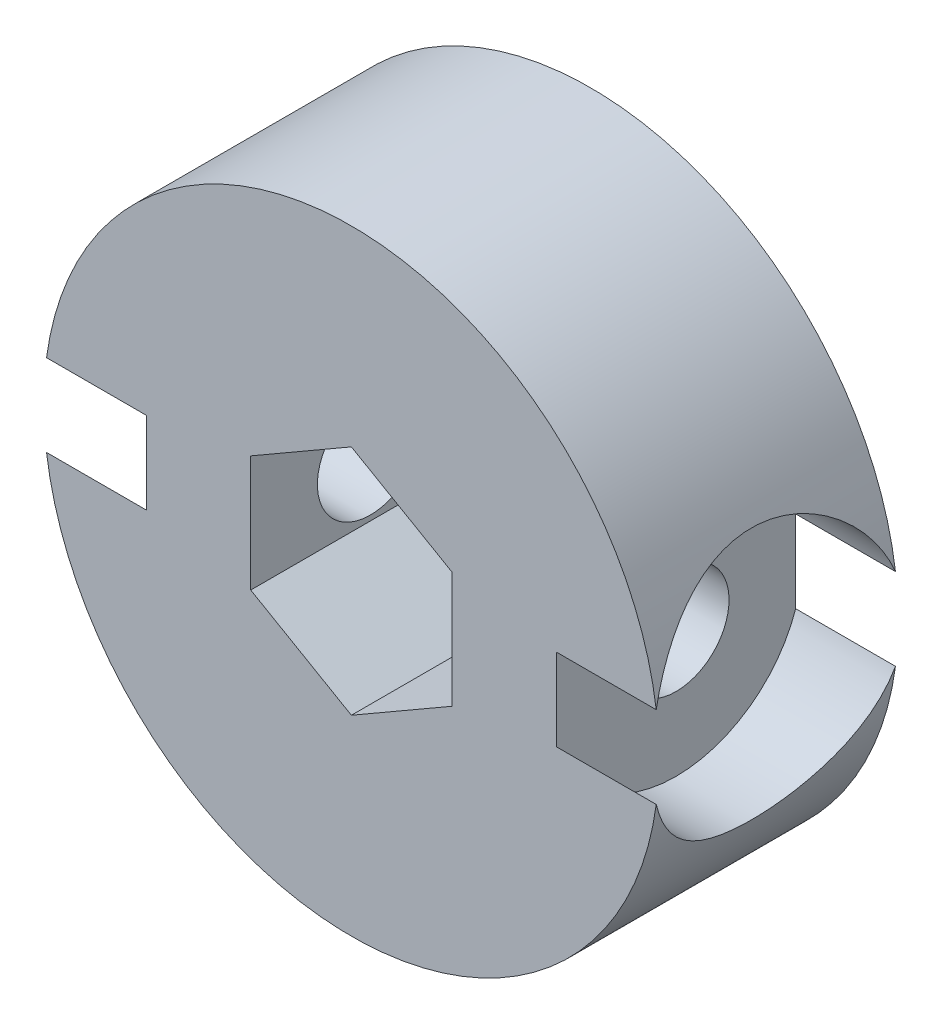
ISO-10303-21;
HEADER;
FILE_DESCRIPTION(('STEP AP214'),'2;1');
FILE_NAME('part.step','',(''),(''),'','','');
FILE_SCHEMA(('AUTOMOTIVE_DESIGN { 1 0 10303 214 1 1 1 1 }'));
ENDSEC;
DATA;
#1=APPLICATION_CONTEXT('core data for automotive mechanical design processes');
#2=APPLICATION_PROTOCOL_DEFINITION('international standard','automotive_design',2000,#1);
#3=PRODUCT_CONTEXT('',#1,'mechanical');
#4=PRODUCT('Part','Part','',(#3));
#5=PRODUCT_RELATED_PRODUCT_CATEGORY('part','',(#4));
#6=PRODUCT_DEFINITION_FORMATION('','',#4);
#7=PRODUCT_DEFINITION_CONTEXT('part definition',#1,'design');
#8=PRODUCT_DEFINITION('design','',#6,#7);
#9=PRODUCT_DEFINITION_SHAPE('','',#8);
#10=(LENGTH_UNIT() NAMED_UNIT(*) SI_UNIT(.MILLI.,.METRE.));
#11=(NAMED_UNIT(*) PLANE_ANGLE_UNIT() SI_UNIT($,.RADIAN.));
#12=(NAMED_UNIT(*) SI_UNIT($,.STERADIAN.) SOLID_ANGLE_UNIT());
#13=UNCERTAINTY_MEASURE_WITH_UNIT(LENGTH_MEASURE(1.E-05),#10,'distance_accuracy_value','');
#14=(GEOMETRIC_REPRESENTATION_CONTEXT(3) GLOBAL_UNCERTAINTY_ASSIGNED_CONTEXT((#13)) GLOBAL_UNIT_ASSIGNED_CONTEXT((#10,
#11,#12)) REPRESENTATION_CONTEXT('',''));
#15=CARTESIAN_POINT('',(0.,0.,0.));
#16=DIRECTION('',(0.,0.,1.));
#17=DIRECTION('',(1.,0.,0.));
#18=AXIS2_PLACEMENT_3D('',#15,#16,#17);
#19=CARTESIAN_POINT('',(0.,0.,7.));
#20=DIRECTION('',(0.,0.,-1.));
#21=DIRECTION('',(-1.,0.,0.));
#22=AXIS2_PLACEMENT_3D('',#19,#20,#21);
#23=CYLINDRICAL_SURFACE('',#22,9.);
#24=CARTESIAN_POINT('',(0.,0.,7.));
#25=DIRECTION('',(0.,0.,1.));
#26=DIRECTION('',(1.,0.,0.));
#27=AXIS2_PLACEMENT_3D('',#24,#25,#26);
#28=CIRCLE('',#27,9.);
#29=CARTESIAN_POINT('',(8.9196412483911,1.2,7.));
#30=VERTEX_POINT('',#29);
#31=CARTESIAN_POINT('',(-8.9196412483911,1.2,7.));
#32=VERTEX_POINT('',#31);
#33=EDGE_CURVE('E298',#30,#32,#28,.T.);
#34=ORIENTED_EDGE('',*,*,#33,.F.);
#35=CARTESIAN_POINT('',(8.9196412483911,1.2,7.));
#36=CARTESIAN_POINT('',(8.90626809793796,1.29949251857575,6.96589804794763));
#37=CARTESIAN_POINT('',(8.89140002769219,1.39732282217841,6.92760612785728));
#38=CARTESIAN_POINT('',(8.85914589320823,1.58899925714202,6.84305709345374));
#39=CARTESIAN_POINT('',(8.84176091138235,1.68284707887054,6.79680340153867));
#40=CARTESIAN_POINT('',(8.80496807073114,1.86580847099153,6.69681221843955));
#41=CARTESIAN_POINT('',(8.78556418059574,1.95493082845511,6.64308934247189));
#42=CARTESIAN_POINT('',(8.74523493945493,2.12809283236352,6.5285326313295));
#43=CARTESIAN_POINT('',(8.72430943980331,2.21213198075605,6.46769810106267));
#44=CARTESIAN_POINT('',(8.66012184925179,2.45568212215107,6.27530654830718));
#45=CARTESIAN_POINT('',(8.61536750142757,2.60701125131476,6.13364977257502));
#46=CARTESIAN_POINT('',(8.52662165599773,2.88409135578642,5.82697440792285));
#47=CARTESIAN_POINT('',(8.4826306550214,3.00982621119692,5.66194120622894));
#48=CARTESIAN_POINT('',(8.39914858714087,3.23561543976487,5.30725128145606));
#49=CARTESIAN_POINT('',(8.35981581945793,3.33486247230502,5.11703934464343));
#50=CARTESIAN_POINT('',(8.29228638882837,3.49942549228331,4.72065480688431));
#51=CARTESIAN_POINT('',(8.26408225962718,3.56476423825546,4.5144930182117));
#52=CARTESIAN_POINT('',(8.22410809543871,3.65601024201857,4.10432277158195));
#53=CARTESIAN_POINT('',(8.21150292089165,3.68392869173448,3.90084543629724));
#54=CARTESIAN_POINT('',(8.20172730977221,3.70565000865944,3.49174425291257));
#55=CARTESIAN_POINT('',(8.20455043616345,3.69946710371561,3.2861213357328));
#56=CARTESIAN_POINT('',(8.22447569093264,3.65492699783362,2.89346661562258));
#57=CARTESIAN_POINT('',(8.240589116939,3.61879676749004,2.70612442731511));
#58=CARTESIAN_POINT('',(8.28382040364898,3.51870209323756,2.34038894163172));
#59=CARTESIAN_POINT('',(8.31094007972558,3.45473305746491,2.16199712598866));
#60=CARTESIAN_POINT('',(8.3741550485406,3.2986072566768,1.81270418580008));
#61=CARTESIAN_POINT('',(8.41051013799791,3.20561283200608,1.6422263447781));
#62=CARTESIAN_POINT('',(8.48788313240785,2.99473432522592,1.31850451741898));
#63=CARTESIAN_POINT('',(8.52890429668783,2.87683279521588,1.16527272821391));
#64=CARTESIAN_POINT('',(8.61503024637854,2.60820403768396,0.867371752163361));
#65=CARTESIAN_POINT('',(8.66019473554975,2.45558132881106,0.724426426820794));
#66=CARTESIAN_POINT('',(8.74647257375524,2.12785990240585,0.465920678067278));
#67=CARTESIAN_POINT('',(8.78759146206376,1.95279269487583,0.350322497095242));
#68=CARTESIAN_POINT('',(8.84269483392267,1.677905492364,0.200704659613329));
#69=CARTESIAN_POINT('',(8.85987090445015,1.58490781596074,0.155029267051946));
#70=CARTESIAN_POINT('',(8.89172653414572,1.39515734492846,0.0715512370869246));
#71=CARTESIAN_POINT('',(8.90640875677066,1.29840869380839,0.033740190657826));
#72=CARTESIAN_POINT('',(8.9196412483911,1.20000000000001,0.));
#73=B_SPLINE_CURVE_WITH_KNOTS('',3,(#35,#36,#37,#38,#39,#40,#41,#42,#43,#44,#45,#46,#47,#48,#49,
#50,#51,#52,#53,#54,#55,#56,#57,#58,#59,#60,#61,#62,#63,#64,#65,#66,#67,#68,#69,#70,#71,#72),
.UNSPECIFIED.,.F.,.F.,(4,2,2,2,2,2,2,2,2,2,2,2,2,2,2,2,2,2,4),(0.,0.31792328604103,
0.635710251262743,0.952883921093625,1.27008861739477,1.90317273862153,2.5366543662896,
3.18767404588844,3.83825620770761,4.45224501720129,5.06597767622857,5.63778080350477,
6.20967828245172,6.79990393800984,7.39054443710112,8.02946647852211,8.66750115856084,
8.98222824002459,9.29661704665973),.UNSPECIFIED.);
#74=CARTESIAN_POINT('',(8.9196412483911,1.20000000000001,0.));
#75=VERTEX_POINT('',#74);
#76=EDGE_CURVE('E168',#30,#75,#73,.T.);
#77=ORIENTED_EDGE('',*,*,#76,.T.);
#78=CARTESIAN_POINT('',(0.,0.,0.));
#79=DIRECTION('',(0.,0.,1.));
#80=DIRECTION('',(1.,0.,0.));
#81=AXIS2_PLACEMENT_3D('',#78,#79,#80);
#82=CIRCLE('',#81,9.);
#83=CARTESIAN_POINT('',(-8.9196412483911,1.2,0.));
#84=VERTEX_POINT('',#83);
#85=EDGE_CURVE('E294',#75,#84,#82,.T.);
#86=ORIENTED_EDGE('',*,*,#85,.T.);
#87=CARTESIAN_POINT('',(-8.9196412483911,1.2,7.));
#88=CARTESIAN_POINT('',(-8.90626809793796,1.29949251857575,6.96589804794763));
#89=CARTESIAN_POINT('',(-8.89140002769219,1.39732282217841,6.92760612785728));
#90=CARTESIAN_POINT('',(-8.85914589320823,1.58899925714202,6.84305709345374));
#91=CARTESIAN_POINT('',(-8.84176091138235,1.68284707887054,6.79680340153867));
#92=CARTESIAN_POINT('',(-8.80496807073114,1.86580847099153,6.69681221843955));
#93=CARTESIAN_POINT('',(-8.78556418059574,1.95493082845511,6.64308934247189));
#94=CARTESIAN_POINT('',(-8.74523493945493,2.12809283236352,6.5285326313295));
#95=CARTESIAN_POINT('',(-8.72430943980331,2.21213198075605,6.46769810106267));
#96=CARTESIAN_POINT('',(-8.66012184925179,2.45568212215107,6.27530654830718));
#97=CARTESIAN_POINT('',(-8.61536750142757,2.60701125131476,6.13364977257502));
#98=CARTESIAN_POINT('',(-8.52662165599774,2.88409135578642,5.82697440792285));
#99=CARTESIAN_POINT('',(-8.4826306550214,3.00982621119692,5.66194120622894));
#100=CARTESIAN_POINT('',(-8.39914858714087,3.23561543976487,5.30725128145606));
#101=CARTESIAN_POINT('',(-8.35981581945794,3.33486247230502,5.11703934464343));
#102=CARTESIAN_POINT('',(-8.29228638882837,3.49942549228331,4.72065480688431));
#103=CARTESIAN_POINT('',(-8.26408225962718,3.56476423825546,4.5144930182117));
#104=CARTESIAN_POINT('',(-8.22410809543871,3.65601024201857,4.10432277158195));
#105=CARTESIAN_POINT('',(-8.21150292089165,3.68392869173448,3.90084543629724));
#106=CARTESIAN_POINT('',(-8.20172730977221,3.70565000865944,3.49174425291257));
#107=CARTESIAN_POINT('',(-8.20455043616346,3.69946710371561,3.2861213357328));
#108=CARTESIAN_POINT('',(-8.22447569093264,3.65492699783362,2.89346661562258));
#109=CARTESIAN_POINT('',(-8.240589116939,3.61879676749004,2.70612442731511));
#110=CARTESIAN_POINT('',(-8.28382040364899,3.51870209323756,2.34038894163171));
#111=CARTESIAN_POINT('',(-8.31094007972558,3.45473305746491,2.16199712598866));
#112=CARTESIAN_POINT('',(-8.3741550485406,3.2986072566768,1.81270418580008));
#113=CARTESIAN_POINT('',(-8.41051013799791,3.20561283200608,1.6422263447781));
#114=CARTESIAN_POINT('',(-8.48788313240785,2.99473432522591,1.31850451741898));
#115=CARTESIAN_POINT('',(-8.52890429668783,2.87683279521588,1.16527272821391));
#116=CARTESIAN_POINT('',(-8.61503024637854,2.60820403768396,0.867371752163361));
#117=CARTESIAN_POINT('',(-8.66019473554975,2.45558132881106,0.724426426820794));
#118=CARTESIAN_POINT('',(-8.74647257375524,2.12785990240585,0.465920678067278));
#119=CARTESIAN_POINT('',(-8.78759146206376,1.95279269487583,0.350322497095242));
#120=CARTESIAN_POINT('',(-8.84269483392267,1.677905492364,0.200704659613329));
#121=CARTESIAN_POINT('',(-8.85987090445015,1.58490781596074,0.155029267051945));
#122=CARTESIAN_POINT('',(-8.89172653414572,1.39515734492846,0.071551237086924));
#123=CARTESIAN_POINT('',(-8.90640875677066,1.29840869380839,0.0337401906578255));
#124=CARTESIAN_POINT('',(-8.9196412483911,1.2,0.));
#125=B_SPLINE_CURVE_WITH_KNOTS('',3,(#87,#88,#89,#90,#91,#92,#93,#94,#95,#96,#97,#98,#99,#100,
#101,#102,#103,#104,#105,#106,#107,#108,#109,#110,#111,#112,#113,#114,#115,#116,#117,#118,#119,
#120,#121,#122,#123,#124),.UNSPECIFIED.,.F.,.F.,(4,2,2,2,2,2,2,2,2,2,2,2,2,2,2,2,2,2,4),(0.,
0.31792328604103,0.635710251262743,0.952883921093625,1.27008861739477,1.90317273862154,
2.5366543662896,3.18767404588844,3.83825620770761,4.45224501720129,5.06597767622857,
5.63778080350477,6.20967828245172,6.79990393800984,7.39054443710112,8.02946647852211,
8.66750115856084,8.98222824002459,9.29661704665973),.UNSPECIFIED.);
#126=EDGE_CURVE('E207',#32,#84,#125,.T.);
#127=ORIENTED_EDGE('',*,*,#126,.F.);
#128=EDGE_LOOP('',(#34,#77,#86,#127));
#129=FACE_BOUND('',#128,.T.);
#130=ADVANCED_FACE('F39',(#129),#23,.T.);
#131=CARTESIAN_POINT('',(-8.9196412483911,-1.20000000000001,0.));
#132=VERTEX_POINT('',#131);
#133=CARTESIAN_POINT('',(8.9196412483911,-1.20000000000001,0.));
#134=VERTEX_POINT('',#133);
#135=EDGE_CURVE('E299',#132,#134,#82,.T.);
#136=ORIENTED_EDGE('',*,*,#135,.T.);
#137=CARTESIAN_POINT('',(8.9196412483911,-1.20000000000001,0.));
#138=CARTESIAN_POINT('',(8.90626809793796,-1.29949251857576,0.0341019520523691));
#139=CARTESIAN_POINT('',(8.89140002769219,-1.39732282217842,0.0723938721427205));
#140=CARTESIAN_POINT('',(8.85914589320823,-1.58899925714202,0.156942906546262));
#141=CARTESIAN_POINT('',(8.84176091138236,-1.68284707887054,0.203196598461335));
#142=CARTESIAN_POINT('',(8.80496807073114,-1.86580847099154,0.30318778156045));
#143=CARTESIAN_POINT('',(8.78556418059574,-1.95493082845511,0.356910657528107));
#144=CARTESIAN_POINT('',(8.74523493945493,-2.12809283236352,0.4714673686705));
#145=CARTESIAN_POINT('',(8.72430943980331,-2.21213198075606,0.532301898937335));
#146=CARTESIAN_POINT('',(8.66012184925179,-2.45568212215108,0.724693451692819));
#147=CARTESIAN_POINT('',(8.61536750142757,-2.60701125131476,0.866350227424982));
#148=CARTESIAN_POINT('',(8.52662165599773,-2.88409135578642,1.17302559207715));
#149=CARTESIAN_POINT('',(8.4826306550214,-3.00982621119692,1.33805879377107));
#150=CARTESIAN_POINT('',(8.39914858714087,-3.23561543976487,1.69274871854395));
#151=CARTESIAN_POINT('',(8.35981581945793,-3.33486247230503,1.88296065535658));
#152=CARTESIAN_POINT('',(8.29228638882837,-3.49942549228331,2.2793451931157));
#153=CARTESIAN_POINT('',(8.26408225962718,-3.56476423825547,2.4855069817883));
#154=CARTESIAN_POINT('',(8.22410809543871,-3.65601024201857,2.89567722841806));
#155=CARTESIAN_POINT('',(8.21150292089165,-3.68392869173448,3.09915456370277));
#156=CARTESIAN_POINT('',(8.20172730977221,-3.70565000865944,3.50825574708744));
#157=CARTESIAN_POINT('',(8.20455043616346,-3.69946710371561,3.7138786642672));
#158=CARTESIAN_POINT('',(8.22447569093264,-3.65492699783362,4.10653338437743));
#159=CARTESIAN_POINT('',(8.240589116939,-3.61879676749004,4.2938755726849));
#160=CARTESIAN_POINT('',(8.28382040364899,-3.51870209323756,4.65961105836829));
#161=CARTESIAN_POINT('',(8.31094007972558,-3.45473305746491,4.83800287401135));
#162=CARTESIAN_POINT('',(8.3741550485406,-3.29860725667679,5.18729581419993));
#163=CARTESIAN_POINT('',(8.41051013799791,-3.20561283200608,5.3577736552219));
#164=CARTESIAN_POINT('',(8.48788313240785,-2.99473432522591,5.68149548258103));
#165=CARTESIAN_POINT('',(8.52890429668783,-2.87683279521587,5.8347272717861));
#166=CARTESIAN_POINT('',(8.61503024637854,-2.60820403768396,6.13262824783664));
#167=CARTESIAN_POINT('',(8.66019473554975,-2.45558132881105,6.27557357317921));
#168=CARTESIAN_POINT('',(8.74647257375524,-2.12785990240585,6.53407932193272));
#169=CARTESIAN_POINT('',(8.78759146206376,-1.95279269487583,6.64967750290476));
#170=CARTESIAN_POINT('',(8.84269483392267,-1.67790549236399,6.79929534038667));
#171=CARTESIAN_POINT('',(8.85987090445015,-1.58490781596074,6.84497073294806));
#172=CARTESIAN_POINT('',(8.89172653414572,-1.39515734492846,6.92844876291308));
#173=CARTESIAN_POINT('',(8.90640875677066,-1.29840869380839,6.96625980934217));
#174=CARTESIAN_POINT('',(8.9196412483911,-1.2,7.));
#175=B_SPLINE_CURVE_WITH_KNOTS('',3,(#137,#138,#139,#140,#141,#142,#143,#144,#145,#146,#147,
#148,#149,#150,#151,#152,#153,#154,#155,#156,#157,#158,#159,#160,#161,#162,#163,#164,#165,#166,
#167,#168,#169,#170,#171,#172,#173,#174),.UNSPECIFIED.,.F.,.F.,(4,2,2,2,2,2,2,2,2,2,2,2,2,2,2,2,
2,2,4),(0.,0.317923286041029,0.635710251262743,0.952883921093624,1.27008861739477,
1.90317273862153,2.5366543662896,3.18767404588844,3.83825620770761,4.45224501720129,
5.06597767622857,5.63778080350477,6.20967828245173,6.79990393800984,7.39054443710112,
8.02946647852211,8.66750115856084,8.98222824002459,9.29661704665973),.UNSPECIFIED.);
#176=CARTESIAN_POINT('',(8.9196412483911,-1.2,7.));
#177=VERTEX_POINT('',#176);
#178=EDGE_CURVE('E150',#134,#177,#175,.T.);
#179=ORIENTED_EDGE('',*,*,#178,.T.);
#180=CARTESIAN_POINT('',(-8.9196412483911,-1.2,7.));
#181=VERTEX_POINT('',#180);
#182=EDGE_CURVE('E166',#181,#177,#28,.T.);
#183=ORIENTED_EDGE('',*,*,#182,.F.);
#184=CARTESIAN_POINT('',(-8.9196412483911,-1.20000000000001,0.));
#185=CARTESIAN_POINT('',(-8.90626809793796,-1.29949251857576,0.034101952052369));
#186=CARTESIAN_POINT('',(-8.89140002769219,-1.39732282217842,0.0723938721427205));
#187=CARTESIAN_POINT('',(-8.85914589320823,-1.58899925714202,0.156942906546262));
#188=CARTESIAN_POINT('',(-8.84176091138236,-1.68284707887054,0.203196598461335));
#189=CARTESIAN_POINT('',(-8.80496807073114,-1.86580847099154,0.303187781560451));
#190=CARTESIAN_POINT('',(-8.78556418059574,-1.95493082845511,0.356910657528108));
#191=CARTESIAN_POINT('',(-8.74523493945493,-2.12809283236352,0.4714673686705));
#192=CARTESIAN_POINT('',(-8.72430943980331,-2.21213198075606,0.532301898937335));
#193=CARTESIAN_POINT('',(-8.66012184925179,-2.45568212215108,0.724693451692819));
#194=CARTESIAN_POINT('',(-8.61536750142757,-2.60701125131476,0.866350227424982));
#195=CARTESIAN_POINT('',(-8.52662165599773,-2.88409135578642,1.17302559207715));
#196=CARTESIAN_POINT('',(-8.48263065502139,-3.00982621119693,1.33805879377107));
#197=CARTESIAN_POINT('',(-8.39914858714087,-3.23561543976487,1.69274871854395));
#198=CARTESIAN_POINT('',(-8.35981581945793,-3.33486247230503,1.88296065535658));
#199=CARTESIAN_POINT('',(-8.29228638882837,-3.49942549228331,2.2793451931157));
#200=CARTESIAN_POINT('',(-8.26408225962718,-3.56476423825547,2.4855069817883));
#201=CARTESIAN_POINT('',(-8.22410809543871,-3.65601024201857,2.89567722841806));
#202=CARTESIAN_POINT('',(-8.21150292089165,-3.68392869173448,3.09915456370277));
#203=CARTESIAN_POINT('',(-8.20172730977221,-3.70565000865945,3.50825574708744));
#204=CARTESIAN_POINT('',(-8.20455043616345,-3.69946710371561,3.7138786642672));
#205=CARTESIAN_POINT('',(-8.22447569093264,-3.65492699783362,4.10653338437743));
#206=CARTESIAN_POINT('',(-8.240589116939,-3.61879676749004,4.29387557268489));
#207=CARTESIAN_POINT('',(-8.28382040364899,-3.51870209323756,4.65961105836829));
#208=CARTESIAN_POINT('',(-8.31094007972558,-3.45473305746491,4.83800287401135));
#209=CARTESIAN_POINT('',(-8.3741550485406,-3.2986072566768,5.18729581419993));
#210=CARTESIAN_POINT('',(-8.41051013799791,-3.20561283200608,5.3577736552219));
#211=CARTESIAN_POINT('',(-8.48788313240785,-2.99473432522591,5.68149548258102));
#212=CARTESIAN_POINT('',(-8.52890429668783,-2.87683279521587,5.8347272717861));
#213=CARTESIAN_POINT('',(-8.61503024637854,-2.60820403768396,6.13262824783664));
#214=CARTESIAN_POINT('',(-8.66019473554975,-2.45558132881105,6.27557357317921));
#215=CARTESIAN_POINT('',(-8.74647257375524,-2.12785990240585,6.53407932193272));
#216=CARTESIAN_POINT('',(-8.78759146206376,-1.95279269487583,6.64967750290476));
#217=CARTESIAN_POINT('',(-8.84269483392267,-1.677905492364,6.79929534038667));
#218=CARTESIAN_POINT('',(-8.85987090445015,-1.58490781596074,6.84497073294806));
#219=CARTESIAN_POINT('',(-8.89172653414572,-1.39515734492846,6.92844876291308));
#220=CARTESIAN_POINT('',(-8.90640875677066,-1.29840869380839,6.96625980934217));
#221=CARTESIAN_POINT('',(-8.9196412483911,-1.2,7.));
#222=B_SPLINE_CURVE_WITH_KNOTS('',3,(#184,#185,#186,#187,#188,#189,#190,#191,#192,#193,#194,
#195,#196,#197,#198,#199,#200,#201,#202,#203,#204,#205,#206,#207,#208,#209,#210,#211,#212,#213,
#214,#215,#216,#217,#218,#219,#220,#221),.UNSPECIFIED.,.F.,.F.,(4,2,2,2,2,2,2,2,2,2,2,2,2,2,2,2,
2,2,4),(0.,0.31792328604103,0.635710251262743,0.952883921093625,1.27008861739477,
1.90317273862154,2.5366543662896,3.18767404588844,3.83825620770761,4.45224501720129,
5.06597767622857,5.63778080350477,6.20967828245172,6.79990393800984,7.39054443710112,
8.02946647852211,8.66750115856084,8.98222824002459,9.29661704665973),.UNSPECIFIED.);
#223=EDGE_CURVE('E215',#132,#181,#222,.T.);
#224=ORIENTED_EDGE('',*,*,#223,.F.);
#225=EDGE_LOOP('',(#136,#179,#183,#224));
#226=FACE_BOUND('',#225,.T.);
#227=ADVANCED_FACE('F41',(#226),#23,.T.);
#228=CARTESIAN_POINT('',(0.,0.,7.));
#229=DIRECTION('',(0.,0.,1.));
#230=DIRECTION('',(1.,0.,0.));
#231=AXIS2_PLACEMENT_3D('',#228,#229,#230);
#232=PLANE('',#231);
#233=DIRECTION('',(-1.,0.,0.));
#234=VECTOR('',#233,1.);
#235=CARTESIAN_POINT('',(11.5,1.2,7.));
#236=LINE('',#235,#234);
#237=CARTESIAN_POINT('',(6.,1.2,7.));
#238=VERTEX_POINT('',#237);
#239=EDGE_CURVE('E173',#30,#238,#236,.T.);
#240=ORIENTED_EDGE('',*,*,#239,.F.);
#241=ORIENTED_EDGE('',*,*,#33,.T.);
#242=DIRECTION('',(1.,0.,0.));
#243=VECTOR('',#242,1.);
#244=CARTESIAN_POINT('',(-11.5,1.2,7.));
#245=LINE('',#244,#243);
#246=CARTESIAN_POINT('',(-6.,1.2,7.));
#247=VERTEX_POINT('',#246);
#248=EDGE_CURVE('E223',#32,#247,#245,.T.);
#249=ORIENTED_EDGE('',*,*,#248,.T.);
#250=DIRECTION('',(0.,-1.,0.));
#251=VECTOR('',#250,1.);
#252=CARTESIAN_POINT('',(-6.,0.,7.));
#253=LINE('',#252,#251);
#254=CARTESIAN_POINT('',(-6.,-1.2,7.));
#255=VERTEX_POINT('',#254);
#256=EDGE_CURVE('E333',#247,#255,#253,.T.);
#257=ORIENTED_EDGE('',*,*,#256,.T.);
#258=DIRECTION('',(1.,0.,0.));
#259=VECTOR('',#258,1.);
#260=CARTESIAN_POINT('',(-11.5,-1.2,7.));
#261=LINE('',#260,#259);
#262=EDGE_CURVE('E222',#255,#181,#261,.F.);
#263=ORIENTED_EDGE('',*,*,#262,.T.);
#264=ORIENTED_EDGE('',*,*,#182,.T.);
#265=DIRECTION('',(-1.,0.,0.));
#266=VECTOR('',#265,1.);
#267=CARTESIAN_POINT('',(11.5,-1.2,7.));
#268=LINE('',#267,#266);
#269=CARTESIAN_POINT('',(6.,-1.2,7.));
#270=VERTEX_POINT('',#269);
#271=EDGE_CURVE('E155',#270,#177,#268,.F.);
#272=ORIENTED_EDGE('',*,*,#271,.F.);
#273=DIRECTION('',(0.,-1.,0.));
#274=VECTOR('',#273,1.);
#275=CARTESIAN_POINT('',(6.,0.,7.));
#276=LINE('',#275,#274);
#277=EDGE_CURVE('E141',#238,#270,#276,.T.);
#278=ORIENTED_EDGE('',*,*,#277,.F.);
#279=EDGE_LOOP('',(#240,#241,#249,#257,#263,#264,#272,#278));
#280=FACE_BOUND('',#279,.T.);
#281=DIRECTION('',(-0.866025403784438,0.500000000000001,0.));
#282=VECTOR('',#281,1.);
#283=CARTESIAN_POINT('',(0.,3.4,7.));
#284=LINE('',#283,#282);
#285=CARTESIAN_POINT('',(2.94448637286709,1.7,7.));
#286=VERTEX_POINT('',#285);
#287=CARTESIAN_POINT('',(0.,3.4,7.));
#288=VERTEX_POINT('',#287);
#289=EDGE_CURVE('E235',#286,#288,#284,.T.);
#290=ORIENTED_EDGE('',*,*,#289,.F.);
#291=DIRECTION('',(0.,1.,0.));
#292=VECTOR('',#291,1.);
#293=CARTESIAN_POINT('',(2.94448637286709,1.7,7.));
#294=LINE('',#293,#292);
#295=CARTESIAN_POINT('',(2.94448637286709,-1.7,7.));
#296=VERTEX_POINT('',#295);
#297=EDGE_CURVE('E232',#296,#286,#294,.T.);
#298=ORIENTED_EDGE('',*,*,#297,.F.);
#299=DIRECTION('',(0.866025403784438,0.500000000000001,0.));
#300=VECTOR('',#299,1.);
#301=CARTESIAN_POINT('',(2.94448637286709,-1.7,7.));
#302=LINE('',#301,#300);
#303=CARTESIAN_POINT('',(0.,-3.4,7.));
#304=VERTEX_POINT('',#303);
#305=EDGE_CURVE('E249',#304,#296,#302,.T.);
#306=ORIENTED_EDGE('',*,*,#305,.F.);
#307=DIRECTION('',(0.86602540378444,-0.499999999999998,0.));
#308=VECTOR('',#307,1.);
#309=CARTESIAN_POINT('',(0.,-3.4,7.));
#310=LINE('',#309,#308);
#311=CARTESIAN_POINT('',(-2.94448637286709,-1.70000000000001,7.));
#312=VERTEX_POINT('',#311);
#313=EDGE_CURVE('E245',#312,#304,#310,.T.);
#314=ORIENTED_EDGE('',*,*,#313,.F.);
#315=DIRECTION('',(0.,-1.,0.));
#316=VECTOR('',#315,1.);
#317=CARTESIAN_POINT('',(-2.94448637286709,-1.70000000000001,7.));
#318=LINE('',#317,#316);
#319=CARTESIAN_POINT('',(-2.94448637286709,1.70000000000001,7.));
#320=VERTEX_POINT('',#319);
#321=EDGE_CURVE('E242',#320,#312,#318,.T.);
#322=ORIENTED_EDGE('',*,*,#321,.F.);
#323=DIRECTION('',(-0.86602540378444,-0.499999999999998,0.));
#324=VECTOR('',#323,1.);
#325=CARTESIAN_POINT('',(-2.94448637286709,1.70000000000001,7.));
#326=LINE('',#325,#324);
#327=EDGE_CURVE('E239',#288,#320,#326,.T.);
#328=ORIENTED_EDGE('',*,*,#327,.F.);
#329=EDGE_LOOP('',(#290,#298,#306,#314,#322,#328));
#330=FACE_BOUND('',#329,.T.);
#331=ADVANCED_FACE('F162',(#280,#330),#232,.T.);
#332=CARTESIAN_POINT('',(0.,0.,0.));
#333=DIRECTION('',(0.,0.,1.));
#334=DIRECTION('',(1.,0.,0.));
#335=AXIS2_PLACEMENT_3D('',#332,#333,#334);
#336=PLANE('',#335);
#337=ORIENTED_EDGE('',*,*,#85,.F.);
#338=DIRECTION('',(-1.,0.,0.));
#339=VECTOR('',#338,1.);
#340=CARTESIAN_POINT('',(11.5,1.20000000000001,0.));
#341=LINE('',#340,#339);
#342=CARTESIAN_POINT('',(6.,1.20000000000001,0.));
#343=VERTEX_POINT('',#342);
#344=EDGE_CURVE('E11',#75,#343,#341,.T.);
#345=ORIENTED_EDGE('',*,*,#344,.T.);
#346=DIRECTION('',(0.,-1.,0.));
#347=VECTOR('',#346,1.);
#348=CARTESIAN_POINT('',(6.,0.,0.));
#349=LINE('',#348,#347);
#350=CARTESIAN_POINT('',(6.,-1.20000000000001,0.));
#351=VERTEX_POINT('',#350);
#352=EDGE_CURVE('E151',#343,#351,#349,.T.);
#353=ORIENTED_EDGE('',*,*,#352,.T.);
#354=DIRECTION('',(-1.,0.,0.));
#355=VECTOR('',#354,1.);
#356=CARTESIAN_POINT('',(11.5,-1.20000000000001,0.));
#357=LINE('',#356,#355);
#358=EDGE_CURVE('E49',#351,#134,#357,.F.);
#359=ORIENTED_EDGE('',*,*,#358,.T.);
#360=ORIENTED_EDGE('',*,*,#135,.F.);
#361=DIRECTION('',(1.,0.,0.));
#362=VECTOR('',#361,1.);
#363=CARTESIAN_POINT('',(-11.5,-1.20000000000001,0.));
#364=LINE('',#363,#362);
#365=CARTESIAN_POINT('',(-6.,-1.20000000000001,0.));
#366=VERTEX_POINT('',#365);
#367=EDGE_CURVE('E313',#366,#132,#364,.F.);
#368=ORIENTED_EDGE('',*,*,#367,.F.);
#369=DIRECTION('',(0.,-1.,0.));
#370=VECTOR('',#369,1.);
#371=CARTESIAN_POINT('',(-6.,0.,0.));
#372=LINE('',#371,#370);
#373=CARTESIAN_POINT('',(-6.,1.2,0.));
#374=VERTEX_POINT('',#373);
#375=EDGE_CURVE('E310',#374,#366,#372,.T.);
#376=ORIENTED_EDGE('',*,*,#375,.F.);
#377=DIRECTION('',(1.,0.,0.));
#378=VECTOR('',#377,1.);
#379=CARTESIAN_POINT('',(-11.5,1.2,0.));
#380=LINE('',#379,#378);
#381=EDGE_CURVE('E297',#84,#374,#380,.T.);
#382=ORIENTED_EDGE('',*,*,#381,.F.);
#383=EDGE_LOOP('',(#337,#345,#353,#359,#360,#368,#376,#382));
#384=FACE_BOUND('',#383,.T.);
#385=DIRECTION('',(0.,1.,0.));
#386=VECTOR('',#385,1.);
#387=CARTESIAN_POINT('',(2.94448637286709,1.7,0.));
#388=LINE('',#387,#386);
#389=CARTESIAN_POINT('',(2.94448637286709,-1.7,0.));
#390=VERTEX_POINT('',#389);
#391=CARTESIAN_POINT('',(2.94448637286709,1.7,0.));
#392=VERTEX_POINT('',#391);
#393=EDGE_CURVE('E231',#390,#392,#388,.T.);
#394=ORIENTED_EDGE('',*,*,#393,.T.);
#395=DIRECTION('',(-0.866025403784438,0.500000000000001,0.));
#396=VECTOR('',#395,1.);
#397=CARTESIAN_POINT('',(0.,3.4,0.));
#398=LINE('',#397,#396);
#399=CARTESIAN_POINT('',(0.,3.4,0.));
#400=VERTEX_POINT('',#399);
#401=EDGE_CURVE('E256',#392,#400,#398,.T.);
#402=ORIENTED_EDGE('',*,*,#401,.T.);
#403=DIRECTION('',(-0.86602540378444,-0.499999999999998,0.));
#404=VECTOR('',#403,1.);
#405=CARTESIAN_POINT('',(-2.94448637286709,1.70000000000001,0.));
#406=LINE('',#405,#404);
#407=CARTESIAN_POINT('',(-2.94448637286709,1.70000000000001,0.));
#408=VERTEX_POINT('',#407);
#409=EDGE_CURVE('E260',#400,#408,#406,.T.);
#410=ORIENTED_EDGE('',*,*,#409,.T.);
#411=DIRECTION('',(0.,-1.,0.));
#412=VECTOR('',#411,1.);
#413=CARTESIAN_POINT('',(-2.94448637286709,-1.70000000000001,0.));
#414=LINE('',#413,#412);
#415=CARTESIAN_POINT('',(-2.94448637286709,-1.70000000000001,0.));
#416=VERTEX_POINT('',#415);
#417=EDGE_CURVE('E264',#408,#416,#414,.T.);
#418=ORIENTED_EDGE('',*,*,#417,.T.);
#419=DIRECTION('',(0.86602540378444,-0.499999999999998,0.));
#420=VECTOR('',#419,1.);
#421=CARTESIAN_POINT('',(0.,-3.4,0.));
#422=LINE('',#421,#420);
#423=CARTESIAN_POINT('',(0.,-3.4,0.));
#424=VERTEX_POINT('',#423);
#425=EDGE_CURVE('E268',#416,#424,#422,.T.);
#426=ORIENTED_EDGE('',*,*,#425,.T.);
#427=DIRECTION('',(0.866025403784438,0.500000000000001,0.));
#428=VECTOR('',#427,1.);
#429=CARTESIAN_POINT('',(2.94448637286709,-1.7,0.));
#430=LINE('',#429,#428);
#431=EDGE_CURVE('E236',#424,#390,#430,.T.);
#432=ORIENTED_EDGE('',*,*,#431,.T.);
#433=EDGE_LOOP('',(#394,#402,#410,#418,#426,#432));
#434=FACE_BOUND('',#433,.T.);
#435=ADVANCED_FACE('F323',(#384,#434),#336,.F.);
#436=CARTESIAN_POINT('',(-9.,0.,3.5));
#437=DIRECTION('',(1.,0.,0.));
#438=DIRECTION('',(0.,1.,0.));
#439=AXIS2_PLACEMENT_3D('',#436,#437,#438);
#440=CYLINDRICAL_SURFACE('',#439,1.55);
#441=CARTESIAN_POINT('',(-2.94448637286709,0.,3.5));
#442=DIRECTION('',(1.,0.,0.));
#443=DIRECTION('',(0.,0.,-1.));
#444=AXIS2_PLACEMENT_3D('',#441,#442,#443);
#445=CIRCLE('',#444,1.55);
#446=CARTESIAN_POINT('',(-2.94448637286709,0.,1.95));
#447=VERTEX_POINT('',#446);
#448=EDGE_CURVE('E226',#447,#447,#445,.F.);
#449=ORIENTED_EDGE('',*,*,#448,.F.);
#450=EDGE_LOOP('',(#449));
#451=FACE_BOUND('',#450,.T.);
#452=CARTESIAN_POINT('',(-6.,0.,3.5));
#453=DIRECTION('',(-1.,0.,0.));
#454=DIRECTION('',(0.,-1.,0.));
#455=AXIS2_PLACEMENT_3D('',#452,#453,#454);
#456=CIRCLE('',#455,1.55);
#457=CARTESIAN_POINT('',(-6.,-1.55,3.5));
#458=VERTEX_POINT('',#457);
#459=EDGE_CURVE('E306',#458,#458,#456,.T.);
#460=ORIENTED_EDGE('',*,*,#459,.T.);
#461=EDGE_LOOP('',(#460));
#462=FACE_BOUND('',#461,.T.);
#463=ADVANCED_FACE('F203',(#451,#462),#440,.F.);
#464=CARTESIAN_POINT('',(2.94448637286709,1.7,7.));
#465=DIRECTION('',(-1.,0.,0.));
#466=DIRECTION('',(0.,0.,1.));
#467=AXIS2_PLACEMENT_3D('',#464,#465,#466);
#468=PLANE('',#467);
#469=CARTESIAN_POINT('',(2.94448637286709,0.,3.5));
#470=DIRECTION('',(-1.,0.,0.));
#471=DIRECTION('',(0.,0.,1.));
#472=AXIS2_PLACEMENT_3D('',#469,#470,#471);
#473=CIRCLE('',#472,1.55);
#474=CARTESIAN_POINT('',(2.94448637286709,0.,5.05));
#475=VERTEX_POINT('',#474);
#476=EDGE_CURVE('E227',#475,#475,#473,.F.);
#477=ORIENTED_EDGE('',*,*,#476,.T.);
#478=EDGE_LOOP('',(#477));
#479=FACE_BOUND('',#478,.T.);
#480=ORIENTED_EDGE('',*,*,#393,.F.);
#481=DIRECTION('',(0.,0.,-1.));
#482=VECTOR('',#481,1.);
#483=CARTESIAN_POINT('',(2.94448637286709,-1.7,7.));
#484=LINE('',#483,#482);
#485=EDGE_CURVE('E252',#296,#390,#484,.T.);
#486=ORIENTED_EDGE('',*,*,#485,.F.);
#487=ORIENTED_EDGE('',*,*,#297,.T.);
#488=DIRECTION('',(0.,0.,-1.));
#489=VECTOR('',#488,1.);
#490=CARTESIAN_POINT('',(2.94448637286709,1.7,7.));
#491=LINE('',#490,#489);
#492=EDGE_CURVE('E290',#286,#392,#491,.T.);
#493=ORIENTED_EDGE('',*,*,#492,.T.);
#494=EDGE_LOOP('',(#480,#486,#487,#493));
#495=FACE_BOUND('',#494,.T.);
#496=ADVANCED_FACE('F365',(#479,#495),#468,.T.);
#497=CARTESIAN_POINT('',(0.,3.4,7.));
#498=DIRECTION('',(-0.500000000000001,-0.866025403784438,0.));
#499=DIRECTION('',(0.866025403784438,-0.500000000000001,0.));
#500=AXIS2_PLACEMENT_3D('',#497,#498,#499);
#501=PLANE('',#500);
#502=ORIENTED_EDGE('',*,*,#401,.F.);
#503=ORIENTED_EDGE('',*,*,#492,.F.);
#504=ORIENTED_EDGE('',*,*,#289,.T.);
#505=DIRECTION('',(0.,0.,-1.));
#506=VECTOR('',#505,1.);
#507=CARTESIAN_POINT('',(0.,3.4,7.));
#508=LINE('',#507,#506);
#509=EDGE_CURVE('E287',#288,#400,#508,.T.);
#510=ORIENTED_EDGE('',*,*,#509,.T.);
#511=EDGE_LOOP('',(#502,#503,#504,#510));
#512=FACE_BOUND('',#511,.T.);
#513=ADVANCED_FACE('F368',(#512),#501,.T.);
#514=CARTESIAN_POINT('',(-2.94448637286709,1.70000000000001,7.));
#515=DIRECTION('',(0.499999999999998,-0.86602540378444,0.));
#516=DIRECTION('',(0.86602540378444,0.499999999999998,0.));
#517=AXIS2_PLACEMENT_3D('',#514,#515,#516);
#518=PLANE('',#517);
#519=ORIENTED_EDGE('',*,*,#409,.F.);
#520=ORIENTED_EDGE('',*,*,#509,.F.);
#521=ORIENTED_EDGE('',*,*,#327,.T.);
#522=DIRECTION('',(0.,0.,-1.));
#523=VECTOR('',#522,1.);
#524=CARTESIAN_POINT('',(-2.94448637286709,1.70000000000001,7.));
#525=LINE('',#524,#523);
#526=EDGE_CURVE('E284',#320,#408,#525,.T.);
#527=ORIENTED_EDGE('',*,*,#526,.T.);
#528=EDGE_LOOP('',(#519,#520,#521,#527));
#529=FACE_BOUND('',#528,.T.);
#530=ADVANCED_FACE('F372',(#529),#518,.T.);
#531=CARTESIAN_POINT('',(-2.94448637286709,-1.70000000000001,7.));
#532=DIRECTION('',(1.,0.,0.));
#533=DIRECTION('',(0.,0.,-1.));
#534=AXIS2_PLACEMENT_3D('',#531,#532,#533);
#535=PLANE('',#534);
#536=ORIENTED_EDGE('',*,*,#448,.T.);
#537=EDGE_LOOP('',(#536));
#538=FACE_BOUND('',#537,.T.);
#539=ORIENTED_EDGE('',*,*,#417,.F.);
#540=ORIENTED_EDGE('',*,*,#526,.F.);
#541=ORIENTED_EDGE('',*,*,#321,.T.);
#542=DIRECTION('',(0.,0.,-1.));
#543=VECTOR('',#542,1.);
#544=CARTESIAN_POINT('',(-2.94448637286709,-1.70000000000001,7.));
#545=LINE('',#544,#543);
#546=EDGE_CURVE('E281',#312,#416,#545,.T.);
#547=ORIENTED_EDGE('',*,*,#546,.T.);
#548=EDGE_LOOP('',(#539,#540,#541,#547));
#549=FACE_BOUND('',#548,.T.);
#550=ADVANCED_FACE('F376',(#538,#549),#535,.T.);
#551=CARTESIAN_POINT('',(0.,-3.4,7.));
#552=DIRECTION('',(0.499999999999998,0.86602540378444,0.));
#553=DIRECTION('',(-0.86602540378444,0.499999999999998,0.));
#554=AXIS2_PLACEMENT_3D('',#551,#552,#553);
#555=PLANE('',#554);
#556=ORIENTED_EDGE('',*,*,#425,.F.);
#557=ORIENTED_EDGE('',*,*,#546,.F.);
#558=ORIENTED_EDGE('',*,*,#313,.T.);
#559=DIRECTION('',(0.,0.,-1.));
#560=VECTOR('',#559,1.);
#561=CARTESIAN_POINT('',(0.,-3.4,7.));
#562=LINE('',#561,#560);
#563=EDGE_CURVE('E278',#304,#424,#562,.T.);
#564=ORIENTED_EDGE('',*,*,#563,.T.);
#565=EDGE_LOOP('',(#556,#557,#558,#564));
#566=FACE_BOUND('',#565,.T.);
#567=ADVANCED_FACE('F380',(#566),#555,.T.);
#568=CARTESIAN_POINT('',(2.94448637286709,-1.7,7.));
#569=DIRECTION('',(-0.500000000000001,0.866025403784438,0.));
#570=DIRECTION('',(-0.866025403784438,-0.500000000000001,0.));
#571=AXIS2_PLACEMENT_3D('',#568,#569,#570);
#572=PLANE('',#571);
#573=ORIENTED_EDGE('',*,*,#431,.F.);
#574=ORIENTED_EDGE('',*,*,#563,.F.);
#575=ORIENTED_EDGE('',*,*,#305,.T.);
#576=ORIENTED_EDGE('',*,*,#485,.T.);
#577=EDGE_LOOP('',(#573,#574,#575,#576));
#578=FACE_BOUND('',#577,.T.);
#579=ADVANCED_FACE('F383',(#578),#572,.T.);
#580=CARTESIAN_POINT('',(6.,0.,3.5));
#581=DIRECTION('',(-1.,0.,0.));
#582=DIRECTION('',(0.,-1.,0.));
#583=AXIS2_PLACEMENT_3D('',#580,#581,#582);
#584=CIRCLE('',#583,1.55);
#585=CARTESIAN_POINT('',(6.,-1.55,3.5));
#586=VERTEX_POINT('',#585);
#587=EDGE_CURVE('E316',#586,#586,#584,.T.);
#588=ORIENTED_EDGE('',*,*,#587,.F.);
#589=EDGE_LOOP('',(#588));
#590=FACE_BOUND('',#589,.T.);
#591=ORIENTED_EDGE('',*,*,#476,.F.);
#592=EDGE_LOOP('',(#591));
#593=FACE_BOUND('',#592,.T.);
#594=ADVANCED_FACE('F386',(#590,#593),#440,.F.);
#595=CARTESIAN_POINT('',(-11.5,0.,3.5));
#596=DIRECTION('',(1.,0.,0.));
#597=DIRECTION('',(0.,1.,0.));
#598=AXIS2_PLACEMENT_3D('',#595,#596,#597);
#599=CYLINDRICAL_SURFACE('',#598,3.7);
#600=CARTESIAN_POINT('',(-6.,0.,3.5));
#601=DIRECTION('',(-1.,0.,0.));
#602=DIRECTION('',(0.,-1.,0.));
#603=AXIS2_PLACEMENT_3D('',#600,#601,#602);
#604=CIRCLE('',#603,3.7);
#605=EDGE_CURVE('E340',#366,#255,#604,.T.);
#606=ORIENTED_EDGE('',*,*,#605,.F.);
#607=ORIENTED_EDGE('',*,*,#367,.T.);
#608=ORIENTED_EDGE('',*,*,#223,.T.);
#609=ORIENTED_EDGE('',*,*,#262,.F.);
#610=EDGE_LOOP('',(#606,#607,#608,#609));
#611=FACE_BOUND('',#610,.T.);
#612=ADVANCED_FACE('F197',(#611),#599,.F.);
#613=CARTESIAN_POINT('',(-6.,0.,3.5));
#614=DIRECTION('',(-1.,0.,0.));
#615=DIRECTION('',(0.,-1.,0.));
#616=AXIS2_PLACEMENT_3D('',#613,#614,#615);
#617=PLANE('',#616);
#618=ORIENTED_EDGE('',*,*,#459,.F.);
#619=EDGE_LOOP('',(#618));
#620=FACE_BOUND('',#619,.T.);
#621=EDGE_CURVE('E64',#247,#374,#604,.T.);
#622=ORIENTED_EDGE('',*,*,#621,.T.);
#623=ORIENTED_EDGE('',*,*,#375,.T.);
#624=ORIENTED_EDGE('',*,*,#605,.T.);
#625=ORIENTED_EDGE('',*,*,#256,.F.);
#626=EDGE_LOOP('',(#622,#623,#624,#625));
#627=FACE_BOUND('',#626,.T.);
#628=ADVANCED_FACE('F192',(#620,#627),#617,.T.);
#629=ORIENTED_EDGE('',*,*,#126,.T.);
#630=ORIENTED_EDGE('',*,*,#381,.T.);
#631=ORIENTED_EDGE('',*,*,#621,.F.);
#632=ORIENTED_EDGE('',*,*,#248,.F.);
#633=EDGE_LOOP('',(#629,#630,#631,#632));
#634=FACE_BOUND('',#633,.T.);
#635=ADVANCED_FACE('F196',(#634),#599,.F.);
#636=CARTESIAN_POINT('',(11.5,0.,3.5));
#637=DIRECTION('',(-1.,0.,0.));
#638=DIRECTION('',(0.,-1.,0.));
#639=AXIS2_PLACEMENT_3D('',#636,#637,#638);
#640=CYLINDRICAL_SURFACE('',#639,3.7);
#641=ORIENTED_EDGE('',*,*,#239,.T.);
#642=CARTESIAN_POINT('',(6.,0.,3.5));
#643=DIRECTION('',(-1.,0.,0.));
#644=DIRECTION('',(0.,-1.,0.));
#645=AXIS2_PLACEMENT_3D('',#642,#643,#644);
#646=CIRCLE('',#645,3.7);
#647=EDGE_CURVE('E145',#238,#343,#646,.T.);
#648=ORIENTED_EDGE('',*,*,#647,.T.);
#649=ORIENTED_EDGE('',*,*,#344,.F.);
#650=ORIENTED_EDGE('',*,*,#76,.F.);
#651=EDGE_LOOP('',(#641,#648,#649,#650));
#652=FACE_BOUND('',#651,.T.);
#653=ADVANCED_FACE('F191',(#652),#640,.F.);
#654=CARTESIAN_POINT('',(6.,0.,3.5));
#655=DIRECTION('',(-1.,0.,0.));
#656=DIRECTION('',(0.,-1.,0.));
#657=AXIS2_PLACEMENT_3D('',#654,#655,#656);
#658=PLANE('',#657);
#659=ORIENTED_EDGE('',*,*,#277,.T.);
#660=EDGE_CURVE('E56',#351,#270,#646,.T.);
#661=ORIENTED_EDGE('',*,*,#660,.F.);
#662=ORIENTED_EDGE('',*,*,#352,.F.);
#663=ORIENTED_EDGE('',*,*,#647,.F.);
#664=EDGE_LOOP('',(#659,#661,#662,#663));
#665=FACE_BOUND('',#664,.T.);
#666=ORIENTED_EDGE('',*,*,#587,.T.);
#667=EDGE_LOOP('',(#666));
#668=FACE_BOUND('',#667,.T.);
#669=ADVANCED_FACE('F142',(#665,#668),#658,.F.);
#670=ORIENTED_EDGE('',*,*,#271,.T.);
#671=ORIENTED_EDGE('',*,*,#178,.F.);
#672=ORIENTED_EDGE('',*,*,#358,.F.);
#673=ORIENTED_EDGE('',*,*,#660,.T.);
#674=EDGE_LOOP('',(#670,#671,#672,#673));
#675=FACE_BOUND('',#674,.T.);
#676=ADVANCED_FACE('F154',(#675),#640,.F.);
#677=CLOSED_SHELL('',(#130,#227,#331,#435,#463,#496,#513,#530,#550,#567,#579,#594,#612,#628,
#635,#653,#669,#676));
#678=MANIFOLD_SOLID_BREP('B2',#677);
#679=ADVANCED_BREP_SHAPE_REPRESENTATION('',(#18,#678),#14);
#680=SHAPE_DEFINITION_REPRESENTATION(#9,#679);
ENDSEC;
END-ISO-10303-21;
